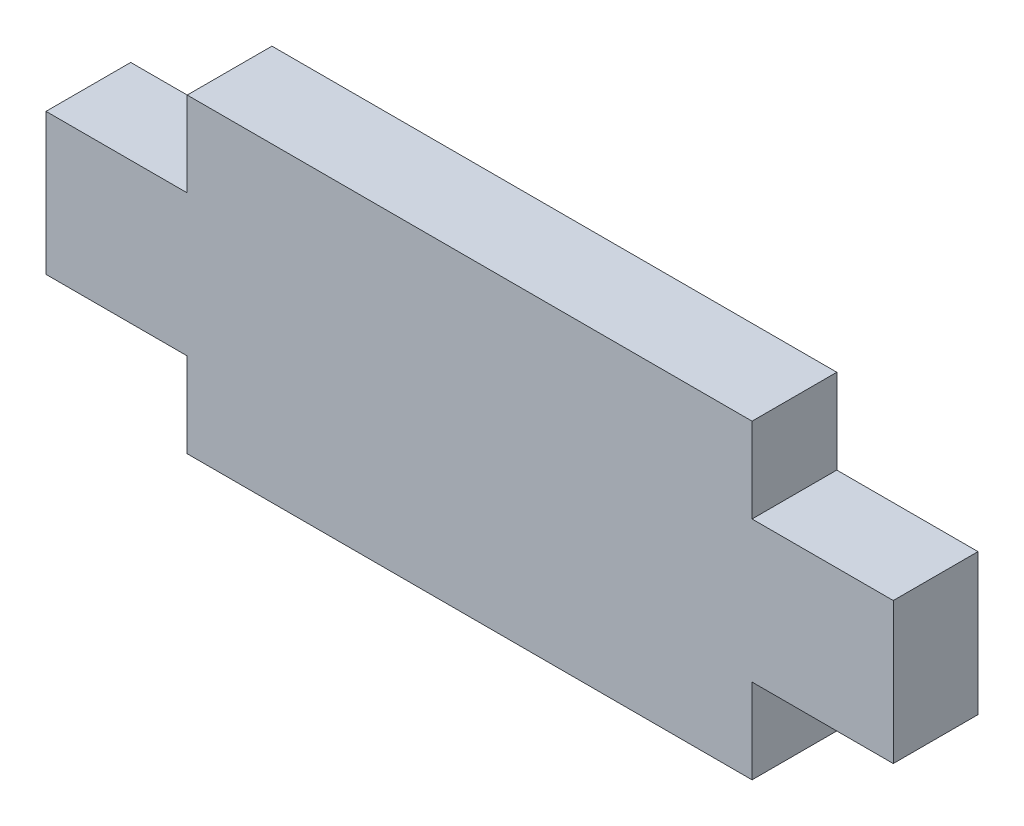
ISO-10303-21;
HEADER;
FILE_DESCRIPTION(('STEP AP214'),'2;1');
FILE_NAME('part.step','',(''),(''),'','','');
FILE_SCHEMA(('AUTOMOTIVE_DESIGN { 1 0 10303 214 1 1 1 1 }'));
ENDSEC;
DATA;
#1=APPLICATION_CONTEXT('core data for automotive mechanical design processes');
#2=APPLICATION_PROTOCOL_DEFINITION('international standard','automotive_design',2000,#1);
#3=PRODUCT_CONTEXT('',#1,'mechanical');
#4=PRODUCT('Part','Part','',(#3));
#5=PRODUCT_RELATED_PRODUCT_CATEGORY('part','',(#4));
#6=PRODUCT_DEFINITION_FORMATION('','',#4);
#7=PRODUCT_DEFINITION_CONTEXT('part definition',#1,'design');
#8=PRODUCT_DEFINITION('design','',#6,#7);
#9=PRODUCT_DEFINITION_SHAPE('','',#8);
#10=(LENGTH_UNIT() NAMED_UNIT(*) SI_UNIT(.MILLI.,.METRE.));
#11=(NAMED_UNIT(*) PLANE_ANGLE_UNIT() SI_UNIT($,.RADIAN.));
#12=(NAMED_UNIT(*) SI_UNIT($,.STERADIAN.) SOLID_ANGLE_UNIT());
#13=UNCERTAINTY_MEASURE_WITH_UNIT(LENGTH_MEASURE(1.E-05),#10,'distance_accuracy_value','');
#14=(GEOMETRIC_REPRESENTATION_CONTEXT(3) GLOBAL_UNCERTAINTY_ASSIGNED_CONTEXT((#13)) GLOBAL_UNIT_ASSIGNED_CONTEXT((#10,
#11,#12)) REPRESENTATION_CONTEXT('',''));
#15=CARTESIAN_POINT('',(0.,0.,0.));
#16=DIRECTION('',(0.,0.,1.));
#17=DIRECTION('',(1.,0.,0.));
#18=AXIS2_PLACEMENT_3D('',#15,#16,#17);
#19=CARTESIAN_POINT('',(10.,0.,3.));
#20=DIRECTION('',(1.,0.,0.));
#21=DIRECTION('',(0.,1.,0.));
#22=AXIS2_PLACEMENT_3D('',#19,#20,#21);
#23=PLANE('',#22);
#24=DIRECTION('',(0.,-1.,0.));
#25=VECTOR('',#24,1.);
#26=CARTESIAN_POINT('',(10.,0.,0.));
#27=LINE('',#26,#25);
#28=CARTESIAN_POINT('',(10.,5.50000000000001,0.));
#29=VERTEX_POINT('',#28);
#30=CARTESIAN_POINT('',(10.,2.5,0.));
#31=VERTEX_POINT('',#30);
#32=EDGE_CURVE('E156',#29,#31,#27,.T.);
#33=ORIENTED_EDGE('',*,*,#32,.F.);
#34=DIRECTION('',(0.,0.,-1.));
#35=VECTOR('',#34,1.);
#36=CARTESIAN_POINT('',(10.,5.50000000000001,3.));
#37=LINE('',#36,#35);
#38=CARTESIAN_POINT('',(10.,5.50000000000001,3.));
#39=VERTEX_POINT('',#38);
#40=EDGE_CURVE('E11',#39,#29,#37,.T.);
#41=ORIENTED_EDGE('',*,*,#40,.F.);
#42=DIRECTION('',(0.,-1.,0.));
#43=VECTOR('',#42,1.);
#44=CARTESIAN_POINT('',(10.,0.,3.));
#45=LINE('',#44,#43);
#46=CARTESIAN_POINT('',(10.,2.5,3.));
#47=VERTEX_POINT('',#46);
#48=EDGE_CURVE('E216',#39,#47,#45,.T.);
#49=ORIENTED_EDGE('',*,*,#48,.T.);
#50=DIRECTION('',(0.,0.,-1.));
#51=VECTOR('',#50,1.);
#52=CARTESIAN_POINT('',(10.,2.5,3.));
#53=LINE('',#52,#51);
#54=EDGE_CURVE('E52',#47,#31,#53,.T.);
#55=ORIENTED_EDGE('',*,*,#54,.T.);
#56=EDGE_LOOP('',(#33,#41,#49,#55));
#57=FACE_BOUND('',#56,.T.);
#58=ADVANCED_FACE('F36',(#57),#23,.T.);
#59=CARTESIAN_POINT('',(0.,5.50000000000001,3.));
#60=DIRECTION('',(0.,1.,0.));
#61=DIRECTION('',(-1.,0.,0.));
#62=AXIS2_PLACEMENT_3D('',#59,#60,#61);
#63=PLANE('',#62);
#64=DIRECTION('',(1.,0.,0.));
#65=VECTOR('',#64,1.);
#66=CARTESIAN_POINT('',(0.,5.50000000000001,0.));
#67=LINE('',#66,#65);
#68=CARTESIAN_POINT('',(-10.,5.50000000000001,0.));
#69=VERTEX_POINT('',#68);
#70=EDGE_CURVE('E158',#69,#29,#67,.T.);
#71=ORIENTED_EDGE('',*,*,#70,.F.);
#72=DIRECTION('',(0.,0.,-1.));
#73=VECTOR('',#72,1.);
#74=CARTESIAN_POINT('',(-10.,5.50000000000001,3.));
#75=LINE('',#74,#73);
#76=CARTESIAN_POINT('',(-10.,5.50000000000001,3.));
#77=VERTEX_POINT('',#76);
#78=EDGE_CURVE('E44',#77,#69,#75,.T.);
#79=ORIENTED_EDGE('',*,*,#78,.F.);
#80=DIRECTION('',(1.,0.,0.));
#81=VECTOR('',#80,1.);
#82=CARTESIAN_POINT('',(0.,5.50000000000001,3.));
#83=LINE('',#82,#81);
#84=EDGE_CURVE('E213',#77,#39,#83,.T.);
#85=ORIENTED_EDGE('',*,*,#84,.T.);
#86=ORIENTED_EDGE('',*,*,#40,.T.);
#87=EDGE_LOOP('',(#71,#79,#85,#86));
#88=FACE_BOUND('',#87,.T.);
#89=ADVANCED_FACE('F212',(#88),#63,.T.);
#90=CARTESIAN_POINT('',(-10.,0.,3.));
#91=DIRECTION('',(1.,0.,0.));
#92=DIRECTION('',(0.,0.,-1.));
#93=AXIS2_PLACEMENT_3D('',#90,#91,#92);
#94=PLANE('',#93);
#95=DIRECTION('',(0.,-1.,0.));
#96=VECTOR('',#95,1.);
#97=CARTESIAN_POINT('',(-10.,0.,0.));
#98=LINE('',#97,#96);
#99=CARTESIAN_POINT('',(-10.,2.5,0.));
#100=VERTEX_POINT('',#99);
#101=EDGE_CURVE('E161',#69,#100,#98,.T.);
#102=ORIENTED_EDGE('',*,*,#101,.T.);
#103=DIRECTION('',(0.,0.,-1.));
#104=VECTOR('',#103,1.);
#105=CARTESIAN_POINT('',(-10.,2.5,3.));
#106=LINE('',#105,#104);
#107=CARTESIAN_POINT('',(-10.,2.5,3.));
#108=VERTEX_POINT('',#107);
#109=EDGE_CURVE('E197',#108,#100,#106,.T.);
#110=ORIENTED_EDGE('',*,*,#109,.F.);
#111=DIRECTION('',(0.,-1.,0.));
#112=VECTOR('',#111,1.);
#113=CARTESIAN_POINT('',(-10.,0.,3.));
#114=LINE('',#113,#112);
#115=EDGE_CURVE('E203',#77,#108,#114,.T.);
#116=ORIENTED_EDGE('',*,*,#115,.F.);
#117=ORIENTED_EDGE('',*,*,#78,.T.);
#118=EDGE_LOOP('',(#102,#110,#116,#117));
#119=FACE_BOUND('',#118,.T.);
#120=ADVANCED_FACE('F201',(#119),#94,.F.);
#121=CARTESIAN_POINT('',(0.,2.5,3.));
#122=DIRECTION('',(0.,1.,0.));
#123=DIRECTION('',(-1.,0.,0.));
#124=AXIS2_PLACEMENT_3D('',#121,#122,#123);
#125=PLANE('',#124);
#126=DIRECTION('',(1.,0.,0.));
#127=VECTOR('',#126,1.);
#128=CARTESIAN_POINT('',(0.,2.5,0.));
#129=LINE('',#128,#127);
#130=CARTESIAN_POINT('',(-15.,2.5,0.));
#131=VERTEX_POINT('',#130);
#132=EDGE_CURVE('E164',#131,#100,#129,.T.);
#133=ORIENTED_EDGE('',*,*,#132,.F.);
#134=DIRECTION('',(0.,0.,-1.));
#135=VECTOR('',#134,1.);
#136=CARTESIAN_POINT('',(-15.,2.5,3.));
#137=LINE('',#136,#135);
#138=CARTESIAN_POINT('',(-15.,2.5,3.));
#139=VERTEX_POINT('',#138);
#140=EDGE_CURVE('E195',#139,#131,#137,.T.);
#141=ORIENTED_EDGE('',*,*,#140,.F.);
#142=DIRECTION('',(1.,0.,0.));
#143=VECTOR('',#142,1.);
#144=CARTESIAN_POINT('',(0.,2.5,3.));
#145=LINE('',#144,#143);
#146=EDGE_CURVE('E152',#139,#108,#145,.T.);
#147=ORIENTED_EDGE('',*,*,#146,.T.);
#148=ORIENTED_EDGE('',*,*,#109,.T.);
#149=EDGE_LOOP('',(#133,#141,#147,#148));
#150=FACE_BOUND('',#149,.T.);
#151=ADVANCED_FACE('F247',(#150),#125,.T.);
#152=CARTESIAN_POINT('',(-15.,0.,3.));
#153=DIRECTION('',(1.,0.,0.));
#154=DIRECTION('',(0.,0.,-1.));
#155=AXIS2_PLACEMENT_3D('',#152,#153,#154);
#156=PLANE('',#155);
#157=DIRECTION('',(0.,-1.,0.));
#158=VECTOR('',#157,1.);
#159=CARTESIAN_POINT('',(-15.,0.,0.));
#160=LINE('',#159,#158);
#161=CARTESIAN_POINT('',(-15.,-2.5,0.));
#162=VERTEX_POINT('',#161);
#163=EDGE_CURVE('E167',#131,#162,#160,.T.);
#164=ORIENTED_EDGE('',*,*,#163,.T.);
#165=DIRECTION('',(0.,0.,-1.));
#166=VECTOR('',#165,1.);
#167=CARTESIAN_POINT('',(-15.,-2.5,3.));
#168=LINE('',#167,#166);
#169=CARTESIAN_POINT('',(-15.,-2.5,3.));
#170=VERTEX_POINT('',#169);
#171=EDGE_CURVE('E192',#170,#162,#168,.T.);
#172=ORIENTED_EDGE('',*,*,#171,.F.);
#173=DIRECTION('',(0.,-1.,0.));
#174=VECTOR('',#173,1.);
#175=CARTESIAN_POINT('',(-15.,0.,3.));
#176=LINE('',#175,#174);
#177=EDGE_CURVE('E222',#139,#170,#176,.T.);
#178=ORIENTED_EDGE('',*,*,#177,.F.);
#179=ORIENTED_EDGE('',*,*,#140,.T.);
#180=EDGE_LOOP('',(#164,#172,#178,#179));
#181=FACE_BOUND('',#180,.T.);
#182=ADVANCED_FACE('F250',(#181),#156,.F.);
#183=CARTESIAN_POINT('',(0.,-2.5,3.));
#184=DIRECTION('',(0.,1.,0.));
#185=DIRECTION('',(-1.,0.,0.));
#186=AXIS2_PLACEMENT_3D('',#183,#184,#185);
#187=PLANE('',#186);
#188=DIRECTION('',(1.,0.,0.));
#189=VECTOR('',#188,1.);
#190=CARTESIAN_POINT('',(0.,-2.5,0.));
#191=LINE('',#190,#189);
#192=CARTESIAN_POINT('',(-10.,-2.5,0.));
#193=VERTEX_POINT('',#192);
#194=EDGE_CURVE('E170',#162,#193,#191,.T.);
#195=ORIENTED_EDGE('',*,*,#194,.T.);
#196=DIRECTION('',(0.,0.,-1.));
#197=VECTOR('',#196,1.);
#198=CARTESIAN_POINT('',(-10.,-2.5,3.));
#199=LINE('',#198,#197);
#200=CARTESIAN_POINT('',(-10.,-2.5,3.));
#201=VERTEX_POINT('',#200);
#202=EDGE_CURVE('E190',#201,#193,#199,.T.);
#203=ORIENTED_EDGE('',*,*,#202,.F.);
#204=DIRECTION('',(1.,0.,0.));
#205=VECTOR('',#204,1.);
#206=CARTESIAN_POINT('',(0.,-2.5,3.));
#207=LINE('',#206,#205);
#208=EDGE_CURVE('E138',#170,#201,#207,.T.);
#209=ORIENTED_EDGE('',*,*,#208,.F.);
#210=ORIENTED_EDGE('',*,*,#171,.T.);
#211=EDGE_LOOP('',(#195,#203,#209,#210));
#212=FACE_BOUND('',#211,.T.);
#213=ADVANCED_FACE('F243',(#212),#187,.F.);
#214=CARTESIAN_POINT('',(-10.,0.,3.));
#215=DIRECTION('',(-1.,0.,0.));
#216=DIRECTION('',(0.,-1.,0.));
#217=AXIS2_PLACEMENT_3D('',#214,#215,#216);
#218=PLANE('',#217);
#219=DIRECTION('',(0.,1.,0.));
#220=VECTOR('',#219,1.);
#221=CARTESIAN_POINT('',(-10.,0.,0.));
#222=LINE('',#221,#220);
#223=CARTESIAN_POINT('',(-9.99999999999999,-5.50000000000001,0.));
#224=VERTEX_POINT('',#223);
#225=EDGE_CURVE('E173',#224,#193,#222,.T.);
#226=ORIENTED_EDGE('',*,*,#225,.F.);
#227=DIRECTION('',(0.,0.,-1.));
#228=VECTOR('',#227,1.);
#229=CARTESIAN_POINT('',(-9.99999999999999,-5.50000000000001,3.));
#230=LINE('',#229,#228);
#231=CARTESIAN_POINT('',(-9.99999999999999,-5.50000000000001,3.));
#232=VERTEX_POINT('',#231);
#233=EDGE_CURVE('E188',#232,#224,#230,.T.);
#234=ORIENTED_EDGE('',*,*,#233,.F.);
#235=DIRECTION('',(0.,1.,0.));
#236=VECTOR('',#235,1.);
#237=CARTESIAN_POINT('',(-10.,0.,3.));
#238=LINE('',#237,#236);
#239=EDGE_CURVE('E224',#232,#201,#238,.T.);
#240=ORIENTED_EDGE('',*,*,#239,.T.);
#241=ORIENTED_EDGE('',*,*,#202,.T.);
#242=EDGE_LOOP('',(#226,#234,#240,#241));
#243=FACE_BOUND('',#242,.T.);
#244=ADVANCED_FACE('F239',(#243),#218,.T.);
#245=CARTESIAN_POINT('',(0.,-5.50000000000001,3.));
#246=DIRECTION('',(0.,1.,0.));
#247=DIRECTION('',(-1.,0.,0.));
#248=AXIS2_PLACEMENT_3D('',#245,#246,#247);
#249=PLANE('',#248);
#250=DIRECTION('',(1.,0.,0.));
#251=VECTOR('',#250,1.);
#252=CARTESIAN_POINT('',(0.,-5.50000000000001,0.));
#253=LINE('',#252,#251);
#254=CARTESIAN_POINT('',(10.,-5.50000000000001,0.));
#255=VERTEX_POINT('',#254);
#256=EDGE_CURVE('E176',#224,#255,#253,.T.);
#257=ORIENTED_EDGE('',*,*,#256,.T.);
#258=DIRECTION('',(0.,0.,-1.));
#259=VECTOR('',#258,1.);
#260=CARTESIAN_POINT('',(10.,-5.50000000000001,3.));
#261=LINE('',#260,#259);
#262=CARTESIAN_POINT('',(10.,-5.50000000000001,3.));
#263=VERTEX_POINT('',#262);
#264=EDGE_CURVE('E185',#263,#255,#261,.T.);
#265=ORIENTED_EDGE('',*,*,#264,.F.);
#266=DIRECTION('',(1.,0.,0.));
#267=VECTOR('',#266,1.);
#268=CARTESIAN_POINT('',(0.,-5.50000000000001,3.));
#269=LINE('',#268,#267);
#270=EDGE_CURVE('E226',#232,#263,#269,.T.);
#271=ORIENTED_EDGE('',*,*,#270,.F.);
#272=ORIENTED_EDGE('',*,*,#233,.T.);
#273=EDGE_LOOP('',(#257,#265,#271,#272));
#274=FACE_BOUND('',#273,.T.);
#275=ADVANCED_FACE('F231',(#274),#249,.F.);
#276=CARTESIAN_POINT('',(10.,0.,3.));
#277=DIRECTION('',(-1.,0.,0.));
#278=DIRECTION('',(0.,-1.,0.));
#279=AXIS2_PLACEMENT_3D('',#276,#277,#278);
#280=PLANE('',#279);
#281=DIRECTION('',(0.,1.,0.));
#282=VECTOR('',#281,1.);
#283=CARTESIAN_POINT('',(10.,0.,0.));
#284=LINE('',#283,#282);
#285=CARTESIAN_POINT('',(10.,-2.5,0.));
#286=VERTEX_POINT('',#285);
#287=EDGE_CURVE('E178',#255,#286,#284,.T.);
#288=ORIENTED_EDGE('',*,*,#287,.T.);
#289=DIRECTION('',(0.,0.,-1.));
#290=VECTOR('',#289,1.);
#291=CARTESIAN_POINT('',(10.,-2.5,3.));
#292=LINE('',#291,#290);
#293=CARTESIAN_POINT('',(10.,-2.5,3.));
#294=VERTEX_POINT('',#293);
#295=EDGE_CURVE('E146',#294,#286,#292,.T.);
#296=ORIENTED_EDGE('',*,*,#295,.F.);
#297=DIRECTION('',(0.,1.,0.));
#298=VECTOR('',#297,1.);
#299=CARTESIAN_POINT('',(10.,0.,3.));
#300=LINE('',#299,#298);
#301=EDGE_CURVE('E133',#263,#294,#300,.T.);
#302=ORIENTED_EDGE('',*,*,#301,.F.);
#303=ORIENTED_EDGE('',*,*,#264,.T.);
#304=EDGE_LOOP('',(#288,#296,#302,#303));
#305=FACE_BOUND('',#304,.T.);
#306=ADVANCED_FACE('F235',(#305),#280,.F.);
#307=CARTESIAN_POINT('',(15.,-2.5,0.));
#308=VERTEX_POINT('',#307);
#309=EDGE_CURVE('E143',#286,#308,#191,.T.);
#310=ORIENTED_EDGE('',*,*,#309,.T.);
#311=DIRECTION('',(0.,0.,-1.));
#312=VECTOR('',#311,1.);
#313=CARTESIAN_POINT('',(15.,-2.5,3.));
#314=LINE('',#313,#312);
#315=CARTESIAN_POINT('',(15.,-2.5,3.));
#316=VERTEX_POINT('',#315);
#317=EDGE_CURVE('E140',#316,#308,#314,.T.);
#318=ORIENTED_EDGE('',*,*,#317,.F.);
#319=EDGE_CURVE('E126',#294,#316,#207,.T.);
#320=ORIENTED_EDGE('',*,*,#319,.F.);
#321=ORIENTED_EDGE('',*,*,#295,.T.);
#322=EDGE_LOOP('',(#310,#318,#320,#321));
#323=FACE_BOUND('',#322,.T.);
#324=ADVANCED_FACE('F141',(#323),#187,.F.);
#325=CARTESIAN_POINT('',(15.,0.,3.));
#326=DIRECTION('',(1.,0.,0.));
#327=DIRECTION('',(0.,0.,-1.));
#328=AXIS2_PLACEMENT_3D('',#325,#326,#327);
#329=PLANE('',#328);
#330=DIRECTION('',(0.,-1.,0.));
#331=VECTOR('',#330,1.);
#332=CARTESIAN_POINT('',(15.,0.,0.));
#333=LINE('',#332,#331);
#334=CARTESIAN_POINT('',(15.,2.5,0.));
#335=VERTEX_POINT('',#334);
#336=EDGE_CURVE('E180',#335,#308,#333,.T.);
#337=ORIENTED_EDGE('',*,*,#336,.F.);
#338=DIRECTION('',(0.,0.,-1.));
#339=VECTOR('',#338,1.);
#340=CARTESIAN_POINT('',(15.,2.5,3.));
#341=LINE('',#340,#339);
#342=CARTESIAN_POINT('',(15.,2.5,3.));
#343=VERTEX_POINT('',#342);
#344=EDGE_CURVE('E89',#343,#335,#341,.T.);
#345=ORIENTED_EDGE('',*,*,#344,.F.);
#346=DIRECTION('',(0.,-1.,0.));
#347=VECTOR('',#346,1.);
#348=CARTESIAN_POINT('',(15.,0.,3.));
#349=LINE('',#348,#347);
#350=EDGE_CURVE('E131',#343,#316,#349,.T.);
#351=ORIENTED_EDGE('',*,*,#350,.T.);
#352=ORIENTED_EDGE('',*,*,#317,.T.);
#353=EDGE_LOOP('',(#337,#345,#351,#352));
#354=FACE_BOUND('',#353,.T.);
#355=ADVANCED_FACE('F148',(#354),#329,.T.);
#356=EDGE_CURVE('E168',#31,#335,#129,.T.);
#357=ORIENTED_EDGE('',*,*,#356,.F.);
#358=ORIENTED_EDGE('',*,*,#54,.F.);
#359=EDGE_CURVE('E149',#47,#343,#145,.T.);
#360=ORIENTED_EDGE('',*,*,#359,.T.);
#361=ORIENTED_EDGE('',*,*,#344,.T.);
#362=EDGE_LOOP('',(#357,#358,#360,#361));
#363=FACE_BOUND('',#362,.T.);
#364=ADVANCED_FACE('F215',(#363),#125,.T.);
#365=CARTESIAN_POINT('',(0.,0.,3.));
#366=DIRECTION('',(0.,0.,1.));
#367=DIRECTION('',(1.,0.,0.));
#368=AXIS2_PLACEMENT_3D('',#365,#366,#367);
#369=PLANE('',#368);
#370=ORIENTED_EDGE('',*,*,#48,.F.);
#371=ORIENTED_EDGE('',*,*,#84,.F.);
#372=ORIENTED_EDGE('',*,*,#115,.T.);
#373=ORIENTED_EDGE('',*,*,#146,.F.);
#374=ORIENTED_EDGE('',*,*,#177,.T.);
#375=ORIENTED_EDGE('',*,*,#208,.T.);
#376=ORIENTED_EDGE('',*,*,#239,.F.);
#377=ORIENTED_EDGE('',*,*,#270,.T.);
#378=ORIENTED_EDGE('',*,*,#301,.T.);
#379=ORIENTED_EDGE('',*,*,#319,.T.);
#380=ORIENTED_EDGE('',*,*,#350,.F.);
#381=ORIENTED_EDGE('',*,*,#359,.F.);
#382=EDGE_LOOP('',(#370,#371,#372,#373,#374,#375,#376,#377,#378,#379,#380,#381));
#383=FACE_BOUND('',#382,.T.);
#384=ADVANCED_FACE('F128',(#383),#369,.T.);
#385=CARTESIAN_POINT('',(0.,0.,0.));
#386=DIRECTION('',(0.,0.,1.));
#387=DIRECTION('',(1.,0.,0.));
#388=AXIS2_PLACEMENT_3D('',#385,#386,#387);
#389=PLANE('',#388);
#390=ORIENTED_EDGE('',*,*,#32,.T.);
#391=ORIENTED_EDGE('',*,*,#356,.T.);
#392=ORIENTED_EDGE('',*,*,#336,.T.);
#393=ORIENTED_EDGE('',*,*,#309,.F.);
#394=ORIENTED_EDGE('',*,*,#287,.F.);
#395=ORIENTED_EDGE('',*,*,#256,.F.);
#396=ORIENTED_EDGE('',*,*,#225,.T.);
#397=ORIENTED_EDGE('',*,*,#194,.F.);
#398=ORIENTED_EDGE('',*,*,#163,.F.);
#399=ORIENTED_EDGE('',*,*,#132,.T.);
#400=ORIENTED_EDGE('',*,*,#101,.F.);
#401=ORIENTED_EDGE('',*,*,#70,.T.);
#402=EDGE_LOOP('',(#390,#391,#392,#393,#394,#395,#396,#397,#398,#399,#400,#401));
#403=FACE_BOUND('',#402,.T.);
#404=ADVANCED_FACE('F209',(#403),#389,.F.);
#405=CLOSED_SHELL('',(#58,#89,#120,#151,#182,#213,#244,#275,#306,#324,#355,#364,#384,#404));
#406=MANIFOLD_SOLID_BREP('B2',#405);
#407=ADVANCED_BREP_SHAPE_REPRESENTATION('',(#18,#406),#14);
#408=SHAPE_DEFINITION_REPRESENTATION(#9,#407);
ENDSEC;
END-ISO-10303-21;
